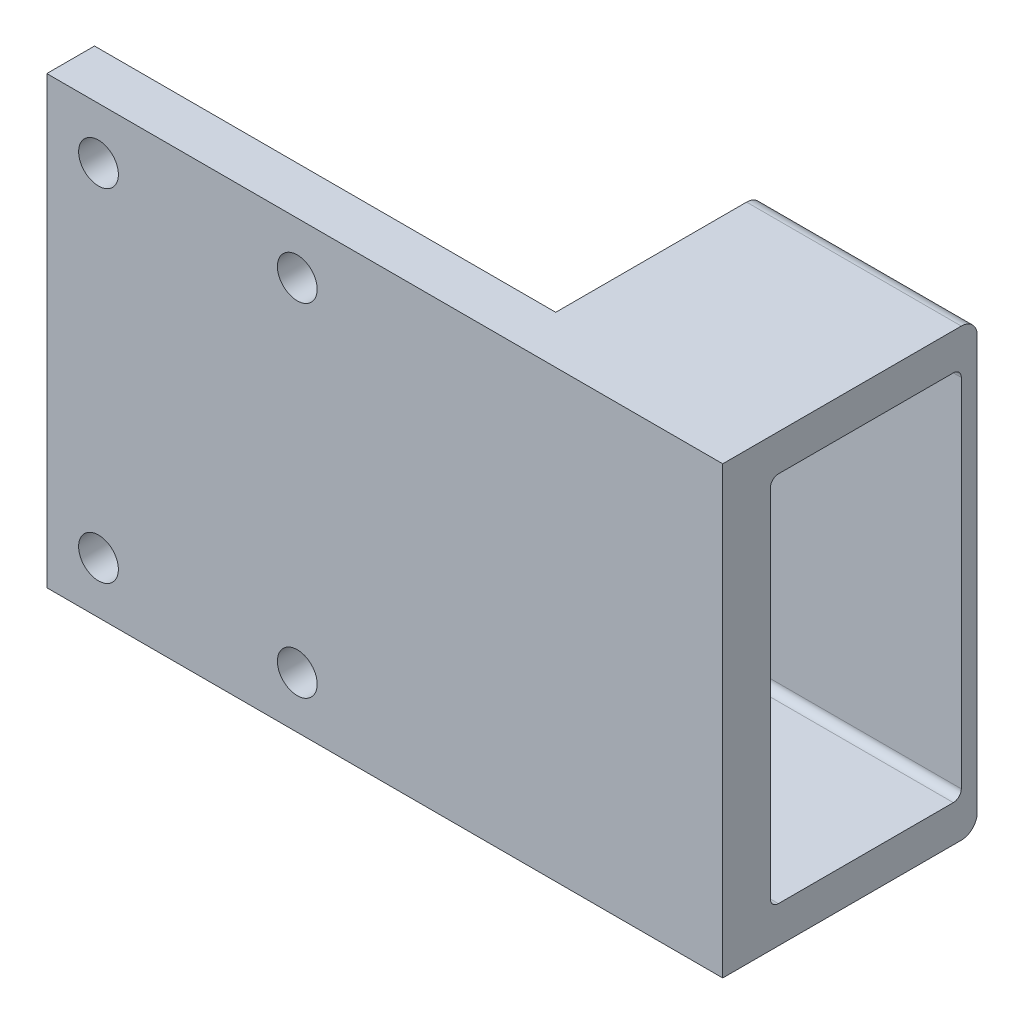
ISO-10303-21;
HEADER;
FILE_DESCRIPTION(('STEP AP214'),'2;1');
FILE_NAME('part.step','',(''),(''),'','','');
FILE_SCHEMA(('AUTOMOTIVE_DESIGN { 1 0 10303 214 1 1 1 1 }'));
ENDSEC;
DATA;
#1=APPLICATION_CONTEXT('core data for automotive mechanical design processes');
#2=APPLICATION_PROTOCOL_DEFINITION('international standard','automotive_design',2000,#1);
#3=PRODUCT_CONTEXT('',#1,'mechanical');
#4=PRODUCT('Part','Part','',(#3));
#5=PRODUCT_RELATED_PRODUCT_CATEGORY('part','',(#4));
#6=PRODUCT_DEFINITION_FORMATION('','',#4);
#7=PRODUCT_DEFINITION_CONTEXT('part definition',#1,'design');
#8=PRODUCT_DEFINITION('design','',#6,#7);
#9=PRODUCT_DEFINITION_SHAPE('','',#8);
#10=(LENGTH_UNIT() NAMED_UNIT(*) SI_UNIT(.MILLI.,.METRE.));
#11=(NAMED_UNIT(*) PLANE_ANGLE_UNIT() SI_UNIT($,.RADIAN.));
#12=(NAMED_UNIT(*) SI_UNIT($,.STERADIAN.) SOLID_ANGLE_UNIT());
#13=UNCERTAINTY_MEASURE_WITH_UNIT(LENGTH_MEASURE(1.E-05),#10,'distance_accuracy_value','');
#14=(GEOMETRIC_REPRESENTATION_CONTEXT(3) GLOBAL_UNCERTAINTY_ASSIGNED_CONTEXT((#13)) GLOBAL_UNIT_ASSIGNED_CONTEXT((#10,
#11,#12)) REPRESENTATION_CONTEXT('',''));
#15=CARTESIAN_POINT('',(0.,0.,0.));
#16=DIRECTION('',(0.,0.,1.));
#17=DIRECTION('',(1.,0.,0.));
#18=AXIS2_PLACEMENT_3D('',#15,#16,#17);
#19=CARTESIAN_POINT('',(0.,0.,3.));
#20=DIRECTION('',(-1.,0.,0.));
#21=DIRECTION('',(0.,-1.,0.));
#22=AXIS2_PLACEMENT_3D('',#19,#20,#21);
#23=PLANE('',#22);
#24=DIRECTION('',(0.,1.,0.));
#25=VECTOR('',#24,1.);
#26=CARTESIAN_POINT('',(0.,-2.3,0.));
#27=LINE('',#26,#25);
#28=CARTESIAN_POINT('',(0.,-25.2,0.));
#29=VERTEX_POINT('',#28);
#30=CARTESIAN_POINT('',(0.,-2.8,0.));
#31=VERTEX_POINT('',#30);
#32=EDGE_CURVE('E358',#29,#31,#27,.T.);
#33=ORIENTED_EDGE('',*,*,#32,.T.);
#34=CARTESIAN_POINT('',(0.,-2.8,-0.5));
#35=DIRECTION('',(-1.,0.,0.));
#36=DIRECTION('',(0.,-1.,0.));
#37=AXIS2_PLACEMENT_3D('',#34,#35,#36);
#38=CIRCLE('',#37,0.5);
#39=CARTESIAN_POINT('',(0.,-2.3,-0.5));
#40=VERTEX_POINT('',#39);
#41=EDGE_CURVE('E265',#31,#40,#38,.T.);
#42=ORIENTED_EDGE('',*,*,#41,.T.);
#43=DIRECTION('',(0.,0.,-1.));
#44=VECTOR('',#43,1.);
#45=CARTESIAN_POINT('',(0.,-2.3,-12.));
#46=LINE('',#45,#44);
#47=CARTESIAN_POINT('',(0.,-2.3,-11.5));
#48=VERTEX_POINT('',#47);
#49=EDGE_CURVE('E178',#40,#48,#46,.T.);
#50=ORIENTED_EDGE('',*,*,#49,.T.);
#51=CARTESIAN_POINT('',(0.,-2.8,-11.5));
#52=DIRECTION('',(-1.,0.,0.));
#53=DIRECTION('',(0.,-1.,0.));
#54=AXIS2_PLACEMENT_3D('',#51,#52,#53);
#55=CIRCLE('',#54,0.5);
#56=CARTESIAN_POINT('',(0.,-2.8,-12.));
#57=VERTEX_POINT('',#56);
#58=EDGE_CURVE('E248',#48,#57,#55,.T.);
#59=ORIENTED_EDGE('',*,*,#58,.T.);
#60=DIRECTION('',(0.,-1.,0.));
#61=VECTOR('',#60,1.);
#62=CARTESIAN_POINT('',(0.,-2.3,-12.));
#63=LINE('',#62,#61);
#64=CARTESIAN_POINT('',(0.,-25.2,-12.));
#65=VERTEX_POINT('',#64);
#66=EDGE_CURVE('E369',#57,#65,#63,.T.);
#67=ORIENTED_EDGE('',*,*,#66,.T.);
#68=CARTESIAN_POINT('',(0.,-25.2,-11.5));
#69=DIRECTION('',(-1.,0.,0.));
#70=DIRECTION('',(0.,-1.,0.));
#71=AXIS2_PLACEMENT_3D('',#68,#69,#70);
#72=CIRCLE('',#71,0.5);
#73=CARTESIAN_POINT('',(0.,-25.7,-11.5));
#74=VERTEX_POINT('',#73);
#75=EDGE_CURVE('E254',#65,#74,#72,.T.);
#76=ORIENTED_EDGE('',*,*,#75,.T.);
#77=DIRECTION('',(0.,0.,1.));
#78=VECTOR('',#77,1.);
#79=CARTESIAN_POINT('',(0.,-25.7,-12.));
#80=LINE('',#79,#78);
#81=CARTESIAN_POINT('',(0.,-25.7,-0.500000000000004));
#82=VERTEX_POINT('',#81);
#83=EDGE_CURVE('E362',#74,#82,#80,.T.);
#84=ORIENTED_EDGE('',*,*,#83,.T.);
#85=CARTESIAN_POINT('',(0.,-25.2,-0.5));
#86=DIRECTION('',(-1.,0.,0.));
#87=DIRECTION('',(0.,-1.,0.));
#88=AXIS2_PLACEMENT_3D('',#85,#86,#87);
#89=CIRCLE('',#88,0.5);
#90=EDGE_CURVE('E260',#82,#29,#89,.T.);
#91=ORIENTED_EDGE('',*,*,#90,.T.);
#92=EDGE_LOOP('',(#33,#42,#50,#59,#67,#76,#84,#91));
#93=FACE_BOUND('',#92,.T.);
#94=DIRECTION('',(0.,0.,-1.));
#95=VECTOR('',#94,1.);
#96=CARTESIAN_POINT('',(0.,-28.,3.));
#97=LINE('',#96,#95);
#98=CARTESIAN_POINT('',(0.,-28.,3.));
#99=VERTEX_POINT('',#98);
#100=CARTESIAN_POINT('',(0.,-28.,-12.));
#101=VERTEX_POINT('',#100);
#102=EDGE_CURVE('E204',#99,#101,#97,.T.);
#103=ORIENTED_EDGE('',*,*,#102,.T.);
#104=CARTESIAN_POINT('',(0.,-27.,-12.));
#105=DIRECTION('',(-1.,0.,0.));
#106=DIRECTION('',(0.,-1.,0.));
#107=AXIS2_PLACEMENT_3D('',#104,#105,#106);
#108=CIRCLE('',#107,1.);
#109=CARTESIAN_POINT('',(0.,-27.,-13.));
#110=VERTEX_POINT('',#109);
#111=EDGE_CURVE('E48',#101,#110,#108,.F.);
#112=ORIENTED_EDGE('',*,*,#111,.T.);
#113=DIRECTION('',(0.,-1.,0.));
#114=VECTOR('',#113,1.);
#115=CARTESIAN_POINT('',(0.,0.,-13.));
#116=LINE('',#115,#114);
#117=CARTESIAN_POINT('',(0.,-1.,-13.));
#118=VERTEX_POINT('',#117);
#119=EDGE_CURVE('E288',#118,#110,#116,.T.);
#120=ORIENTED_EDGE('',*,*,#119,.F.);
#121=CARTESIAN_POINT('',(0.,-1.,-12.));
#122=DIRECTION('',(-1.,0.,0.));
#123=DIRECTION('',(0.,-1.,0.));
#124=AXIS2_PLACEMENT_3D('',#121,#122,#123);
#125=CIRCLE('',#124,1.);
#126=CARTESIAN_POINT('',(0.,0.,-12.));
#127=VERTEX_POINT('',#126);
#128=EDGE_CURVE('E55',#118,#127,#125,.F.);
#129=ORIENTED_EDGE('',*,*,#128,.T.);
#130=DIRECTION('',(0.,0.,-1.));
#131=VECTOR('',#130,1.);
#132=CARTESIAN_POINT('',(0.,0.,3.));
#133=LINE('',#132,#131);
#134=CARTESIAN_POINT('',(0.,0.,3.));
#135=VERTEX_POINT('',#134);
#136=EDGE_CURVE('E214',#135,#127,#133,.T.);
#137=ORIENTED_EDGE('',*,*,#136,.F.);
#138=DIRECTION('',(0.,1.,0.));
#139=VECTOR('',#138,1.);
#140=CARTESIAN_POINT('',(0.,0.,3.));
#141=LINE('',#140,#139);
#142=EDGE_CURVE('E203',#99,#135,#141,.T.);
#143=ORIENTED_EDGE('',*,*,#142,.F.);
#144=EDGE_LOOP('',(#103,#112,#120,#129,#137,#143));
#145=FACE_BOUND('',#144,.T.);
#146=ADVANCED_FACE('F39',(#93,#145),#23,.F.);
#147=CARTESIAN_POINT('',(0.,0.,3.));
#148=DIRECTION('',(0.,-1.,0.));
#149=DIRECTION('',(1.,0.,0.));
#150=AXIS2_PLACEMENT_3D('',#147,#148,#149);
#151=PLANE('',#150);
#152=ORIENTED_EDGE('',*,*,#136,.T.);
#153=DIRECTION('',(1.,0.,0.));
#154=VECTOR('',#153,1.);
#155=CARTESIAN_POINT('',(-13.5,0.,-12.));
#156=LINE('',#155,#154);
#157=CARTESIAN_POINT('',(-13.5,0.,-12.));
#158=VERTEX_POINT('',#157);
#159=EDGE_CURVE('E11',#127,#158,#156,.F.);
#160=ORIENTED_EDGE('',*,*,#159,.T.);
#161=DIRECTION('',(0.,0.,1.));
#162=VECTOR('',#161,1.);
#163=CARTESIAN_POINT('',(-13.5,0.,-13.));
#164=LINE('',#163,#162);
#165=CARTESIAN_POINT('',(-13.5,0.,0.));
#166=VERTEX_POINT('',#165);
#167=EDGE_CURVE('E154',#158,#166,#164,.T.);
#168=ORIENTED_EDGE('',*,*,#167,.T.);
#169=DIRECTION('',(-1.,0.,0.));
#170=VECTOR('',#169,1.);
#171=CARTESIAN_POINT('',(0.,0.,0.));
#172=LINE('',#171,#170);
#173=CARTESIAN_POINT('',(-42.5,0.,0.));
#174=VERTEX_POINT('',#173);
#175=EDGE_CURVE('E159',#166,#174,#172,.T.);
#176=ORIENTED_EDGE('',*,*,#175,.T.);
#177=DIRECTION('',(0.,0.,-1.));
#178=VECTOR('',#177,1.);
#179=CARTESIAN_POINT('',(-42.5,0.,3.));
#180=LINE('',#179,#178);
#181=CARTESIAN_POINT('',(-42.5,0.,3.));
#182=VERTEX_POINT('',#181);
#183=EDGE_CURVE('E211',#182,#174,#180,.T.);
#184=ORIENTED_EDGE('',*,*,#183,.F.);
#185=DIRECTION('',(-1.,0.,0.));
#186=VECTOR('',#185,1.);
#187=CARTESIAN_POINT('',(0.,0.,3.));
#188=LINE('',#187,#186);
#189=EDGE_CURVE('E334',#135,#182,#188,.T.);
#190=ORIENTED_EDGE('',*,*,#189,.F.);
#191=EDGE_LOOP('',(#152,#160,#168,#176,#184,#190));
#192=FACE_BOUND('',#191,.T.);
#193=ADVANCED_FACE('F156',(#192),#151,.F.);
#194=CARTESIAN_POINT('',(-42.5,0.,3.));
#195=DIRECTION('',(1.,0.,0.));
#196=DIRECTION('',(0.,1.,0.));
#197=AXIS2_PLACEMENT_3D('',#194,#195,#196);
#198=PLANE('',#197);
#199=DIRECTION('',(0.,-1.,0.));
#200=VECTOR('',#199,1.);
#201=CARTESIAN_POINT('',(-42.5,0.,0.));
#202=LINE('',#201,#200);
#203=CARTESIAN_POINT('',(-42.5,-28.,0.));
#204=VERTEX_POINT('',#203);
#205=EDGE_CURVE('E185',#174,#204,#202,.T.);
#206=ORIENTED_EDGE('',*,*,#205,.T.);
#207=DIRECTION('',(0.,0.,-1.));
#208=VECTOR('',#207,1.);
#209=CARTESIAN_POINT('',(-42.5,-28.,3.));
#210=LINE('',#209,#208);
#211=CARTESIAN_POINT('',(-42.5,-28.,3.));
#212=VERTEX_POINT('',#211);
#213=EDGE_CURVE('E207',#212,#204,#210,.T.);
#214=ORIENTED_EDGE('',*,*,#213,.F.);
#215=DIRECTION('',(0.,-1.,0.));
#216=VECTOR('',#215,1.);
#217=CARTESIAN_POINT('',(-42.5,0.,3.));
#218=LINE('',#217,#216);
#219=EDGE_CURVE('E336',#182,#212,#218,.T.);
#220=ORIENTED_EDGE('',*,*,#219,.F.);
#221=ORIENTED_EDGE('',*,*,#183,.T.);
#222=EDGE_LOOP('',(#206,#214,#220,#221));
#223=FACE_BOUND('',#222,.T.);
#224=ADVANCED_FACE('F419',(#223),#198,.F.);
#225=CARTESIAN_POINT('',(0.,-28.,3.));
#226=DIRECTION('',(0.,1.,0.));
#227=DIRECTION('',(-1.,0.,0.));
#228=AXIS2_PLACEMENT_3D('',#225,#226,#227);
#229=PLANE('',#228);
#230=DIRECTION('',(0.,0.,1.));
#231=VECTOR('',#230,1.);
#232=CARTESIAN_POINT('',(-13.5,-28.,-13.));
#233=LINE('',#232,#231);
#234=CARTESIAN_POINT('',(-13.5,-28.,-12.));
#235=VERTEX_POINT('',#234);
#236=CARTESIAN_POINT('',(-13.5,-28.,0.));
#237=VERTEX_POINT('',#236);
#238=EDGE_CURVE('E165',#235,#237,#233,.T.);
#239=ORIENTED_EDGE('',*,*,#238,.F.);
#240=DIRECTION('',(-1.,0.,0.));
#241=VECTOR('',#240,1.);
#242=CARTESIAN_POINT('',(0.,-28.,-12.));
#243=LINE('',#242,#241);
#244=EDGE_CURVE('E63',#235,#101,#243,.F.);
#245=ORIENTED_EDGE('',*,*,#244,.T.);
#246=ORIENTED_EDGE('',*,*,#102,.F.);
#247=DIRECTION('',(1.,0.,0.));
#248=VECTOR('',#247,1.);
#249=CARTESIAN_POINT('',(0.,-28.,3.));
#250=LINE('',#249,#248);
#251=EDGE_CURVE('E197',#212,#99,#250,.T.);
#252=ORIENTED_EDGE('',*,*,#251,.F.);
#253=ORIENTED_EDGE('',*,*,#213,.T.);
#254=DIRECTION('',(1.,0.,0.));
#255=VECTOR('',#254,1.);
#256=CARTESIAN_POINT('',(0.,-28.,0.));
#257=LINE('',#256,#255);
#258=EDGE_CURVE('E191',#204,#237,#257,.T.);
#259=ORIENTED_EDGE('',*,*,#258,.T.);
#260=EDGE_LOOP('',(#239,#245,#246,#252,#253,#259));
#261=FACE_BOUND('',#260,.T.);
#262=ADVANCED_FACE('F300',(#261),#229,.F.);
#263=CARTESIAN_POINT('',(0.,0.,3.));
#264=DIRECTION('',(0.,0.,-1.));
#265=DIRECTION('',(-1.,0.,0.));
#266=AXIS2_PLACEMENT_3D('',#263,#264,#265);
#267=PLANE('',#266);
#268=CARTESIAN_POINT('',(-26.75,-24.75,3.));
#269=DIRECTION('',(0.,0.,-1.));
#270=DIRECTION('',(-1.,0.,0.));
#271=AXIS2_PLACEMENT_3D('',#268,#269,#270);
#272=CIRCLE('',#271,1.25);
#273=CARTESIAN_POINT('',(-28.,-24.75,3.));
#274=VERTEX_POINT('',#273);
#275=EDGE_CURVE('E313',#274,#274,#272,.T.);
#276=ORIENTED_EDGE('',*,*,#275,.T.);
#277=EDGE_LOOP('',(#276));
#278=FACE_BOUND('',#277,.T.);
#279=CARTESIAN_POINT('',(-39.25,-3.25,3.));
#280=DIRECTION('',(0.,0.,-1.));
#281=DIRECTION('',(1.,0.,0.));
#282=AXIS2_PLACEMENT_3D('',#279,#280,#281);
#283=CIRCLE('',#282,1.25);
#284=CARTESIAN_POINT('',(-38.,-3.25,3.));
#285=VERTEX_POINT('',#284);
#286=EDGE_CURVE('E321',#285,#285,#283,.T.);
#287=ORIENTED_EDGE('',*,*,#286,.T.);
#288=EDGE_LOOP('',(#287));
#289=FACE_BOUND('',#288,.T.);
#290=CARTESIAN_POINT('',(-26.75,-3.25,3.));
#291=DIRECTION('',(0.,0.,-1.));
#292=DIRECTION('',(1.,0.,0.));
#293=AXIS2_PLACEMENT_3D('',#290,#291,#292);
#294=CIRCLE('',#293,1.25);
#295=CARTESIAN_POINT('',(-25.5,-3.25,3.));
#296=VERTEX_POINT('',#295);
#297=EDGE_CURVE('E306',#296,#296,#294,.T.);
#298=ORIENTED_EDGE('',*,*,#297,.T.);
#299=EDGE_LOOP('',(#298));
#300=FACE_BOUND('',#299,.T.);
#301=CARTESIAN_POINT('',(-39.25,-24.75,3.));
#302=DIRECTION('',(0.,0.,-1.));
#303=DIRECTION('',(-1.,0.,0.));
#304=AXIS2_PLACEMENT_3D('',#301,#302,#303);
#305=CIRCLE('',#304,1.25);
#306=CARTESIAN_POINT('',(-40.5,-24.75,3.));
#307=VERTEX_POINT('',#306);
#308=EDGE_CURVE('E187',#307,#307,#305,.T.);
#309=ORIENTED_EDGE('',*,*,#308,.T.);
#310=EDGE_LOOP('',(#309));
#311=FACE_BOUND('',#310,.T.);
#312=ORIENTED_EDGE('',*,*,#142,.T.);
#313=ORIENTED_EDGE('',*,*,#189,.T.);
#314=ORIENTED_EDGE('',*,*,#219,.T.);
#315=ORIENTED_EDGE('',*,*,#251,.T.);
#316=EDGE_LOOP('',(#312,#313,#314,#315));
#317=FACE_BOUND('',#316,.T.);
#318=ADVANCED_FACE('F343',(#278,#289,#300,#311,#317),#267,.F.);
#319=CARTESIAN_POINT('',(0.,0.,0.));
#320=DIRECTION('',(0.,0.,-1.));
#321=DIRECTION('',(-1.,0.,0.));
#322=AXIS2_PLACEMENT_3D('',#319,#320,#321);
#323=PLANE('',#322);
#324=ORIENTED_EDGE('',*,*,#32,.F.);
#325=DIRECTION('',(-1.,0.,0.));
#326=VECTOR('',#325,1.);
#327=CARTESIAN_POINT('',(0.,-25.2,0.));
#328=LINE('',#327,#326);
#329=CARTESIAN_POINT('',(-13.5,-25.2,0.));
#330=VERTEX_POINT('',#329);
#331=EDGE_CURVE('E241',#29,#330,#328,.T.);
#332=ORIENTED_EDGE('',*,*,#331,.T.);
#333=DIRECTION('',(0.,1.,0.));
#334=VECTOR('',#333,1.);
#335=CARTESIAN_POINT('',(-13.5,0.,0.));
#336=LINE('',#335,#334);
#337=EDGE_CURVE('E177',#237,#330,#336,.T.);
#338=ORIENTED_EDGE('',*,*,#337,.F.);
#339=ORIENTED_EDGE('',*,*,#258,.F.);
#340=ORIENTED_EDGE('',*,*,#205,.F.);
#341=ORIENTED_EDGE('',*,*,#175,.F.);
#342=CARTESIAN_POINT('',(-13.5,-2.8,0.));
#343=VERTEX_POINT('',#342);
#344=EDGE_CURVE('E169',#343,#166,#336,.T.);
#345=ORIENTED_EDGE('',*,*,#344,.F.);
#346=DIRECTION('',(-1.,0.,0.));
#347=VECTOR('',#346,1.);
#348=CARTESIAN_POINT('',(0.,-2.8,0.));
#349=LINE('',#348,#347);
#350=EDGE_CURVE('E238',#343,#31,#349,.F.);
#351=ORIENTED_EDGE('',*,*,#350,.T.);
#352=EDGE_LOOP('',(#324,#332,#338,#339,#340,#341,#345,#351));
#353=FACE_BOUND('',#352,.T.);
#354=CARTESIAN_POINT('',(-26.75,-24.75,0.));
#355=DIRECTION('',(0.,0.,-1.));
#356=DIRECTION('',(-1.,0.,0.));
#357=AXIS2_PLACEMENT_3D('',#354,#355,#356);
#358=CIRCLE('',#357,1.25);
#359=CARTESIAN_POINT('',(-28.,-24.75,0.));
#360=VERTEX_POINT('',#359);
#361=EDGE_CURVE('E317',#360,#360,#358,.T.);
#362=ORIENTED_EDGE('',*,*,#361,.F.);
#363=EDGE_LOOP('',(#362));
#364=FACE_BOUND('',#363,.T.);
#365=CARTESIAN_POINT('',(-39.25,-3.25,0.));
#366=DIRECTION('',(0.,0.,-1.));
#367=DIRECTION('',(1.,0.,0.));
#368=AXIS2_PLACEMENT_3D('',#365,#366,#367);
#369=CIRCLE('',#368,1.25);
#370=CARTESIAN_POINT('',(-38.,-3.25,0.));
#371=VERTEX_POINT('',#370);
#372=EDGE_CURVE('E311',#371,#371,#369,.T.);
#373=ORIENTED_EDGE('',*,*,#372,.F.);
#374=EDGE_LOOP('',(#373));
#375=FACE_BOUND('',#374,.T.);
#376=CARTESIAN_POINT('',(-26.75,-3.25,0.));
#377=DIRECTION('',(0.,0.,-1.));
#378=DIRECTION('',(1.,0.,0.));
#379=AXIS2_PLACEMENT_3D('',#376,#377,#378);
#380=CIRCLE('',#379,1.25);
#381=CARTESIAN_POINT('',(-25.5,-3.25,0.));
#382=VERTEX_POINT('',#381);
#383=EDGE_CURVE('E302',#382,#382,#380,.T.);
#384=ORIENTED_EDGE('',*,*,#383,.F.);
#385=EDGE_LOOP('',(#384));
#386=FACE_BOUND('',#385,.T.);
#387=CARTESIAN_POINT('',(-39.25,-24.75,0.));
#388=DIRECTION('',(0.,0.,-1.));
#389=DIRECTION('',(-1.,0.,0.));
#390=AXIS2_PLACEMENT_3D('',#387,#388,#389);
#391=CIRCLE('',#390,1.25);
#392=CARTESIAN_POINT('',(-40.5,-24.75,0.));
#393=VERTEX_POINT('',#392);
#394=EDGE_CURVE('E194',#393,#393,#391,.T.);
#395=ORIENTED_EDGE('',*,*,#394,.F.);
#396=EDGE_LOOP('',(#395));
#397=FACE_BOUND('',#396,.T.);
#398=ADVANCED_FACE('F182',(#353,#364,#375,#386,#397),#323,.T.);
#399=CARTESIAN_POINT('',(-39.25,-24.75,3.));
#400=DIRECTION('',(0.,0.,-1.));
#401=DIRECTION('',(-1.,0.,0.));
#402=AXIS2_PLACEMENT_3D('',#399,#400,#401);
#403=CYLINDRICAL_SURFACE('',#402,1.25);
#404=ORIENTED_EDGE('',*,*,#308,.F.);
#405=EDGE_LOOP('',(#404));
#406=FACE_BOUND('',#405,.T.);
#407=ORIENTED_EDGE('',*,*,#394,.T.);
#408=EDGE_LOOP('',(#407));
#409=FACE_BOUND('',#408,.T.);
#410=ADVANCED_FACE('F533',(#406,#409),#403,.F.);
#411=CARTESIAN_POINT('',(-26.75,-3.25,3.));
#412=DIRECTION('',(0.,0.,-1.));
#413=DIRECTION('',(-1.,0.,0.));
#414=AXIS2_PLACEMENT_3D('',#411,#412,#413);
#415=CYLINDRICAL_SURFACE('',#414,1.25);
#416=ORIENTED_EDGE('',*,*,#297,.F.);
#417=EDGE_LOOP('',(#416));
#418=FACE_BOUND('',#417,.T.);
#419=ORIENTED_EDGE('',*,*,#383,.T.);
#420=EDGE_LOOP('',(#419));
#421=FACE_BOUND('',#420,.T.);
#422=ADVANCED_FACE('F555',(#418,#421),#415,.F.);
#423=CARTESIAN_POINT('',(-39.25,-3.25,3.));
#424=DIRECTION('',(0.,0.,-1.));
#425=DIRECTION('',(-1.,0.,0.));
#426=AXIS2_PLACEMENT_3D('',#423,#424,#425);
#427=CYLINDRICAL_SURFACE('',#426,1.25);
#428=ORIENTED_EDGE('',*,*,#286,.F.);
#429=EDGE_LOOP('',(#428));
#430=FACE_BOUND('',#429,.T.);
#431=ORIENTED_EDGE('',*,*,#372,.T.);
#432=EDGE_LOOP('',(#431));
#433=FACE_BOUND('',#432,.T.);
#434=ADVANCED_FACE('F545',(#430,#433),#427,.F.);
#435=CARTESIAN_POINT('',(-26.75,-24.75,3.));
#436=DIRECTION('',(0.,0.,-1.));
#437=DIRECTION('',(-1.,0.,0.));
#438=AXIS2_PLACEMENT_3D('',#435,#436,#437);
#439=CYLINDRICAL_SURFACE('',#438,1.25);
#440=ORIENTED_EDGE('',*,*,#275,.F.);
#441=EDGE_LOOP('',(#440));
#442=FACE_BOUND('',#441,.T.);
#443=ORIENTED_EDGE('',*,*,#361,.T.);
#444=EDGE_LOOP('',(#443));
#445=FACE_BOUND('',#444,.T.);
#446=ADVANCED_FACE('F473',(#442,#445),#439,.F.);
#447=CARTESIAN_POINT('',(-13.5,0.,-13.));
#448=DIRECTION('',(1.,0.,0.));
#449=DIRECTION('',(0.,1.,0.));
#450=AXIS2_PLACEMENT_3D('',#447,#448,#449);
#451=PLANE('',#450);
#452=DIRECTION('',(0.,1.,0.));
#453=VECTOR('',#452,1.);
#454=CARTESIAN_POINT('',(-13.5,0.,-13.));
#455=LINE('',#454,#453);
#456=CARTESIAN_POINT('',(-13.5,-27.,-13.));
#457=VERTEX_POINT('',#456);
#458=CARTESIAN_POINT('',(-13.5,-1.,-13.));
#459=VERTEX_POINT('',#458);
#460=EDGE_CURVE('E166',#457,#459,#455,.T.);
#461=ORIENTED_EDGE('',*,*,#460,.F.);
#462=CARTESIAN_POINT('',(-13.5,-27.,-12.));
#463=DIRECTION('',(1.,0.,0.));
#464=DIRECTION('',(0.,1.,0.));
#465=AXIS2_PLACEMENT_3D('',#462,#463,#464);
#466=CIRCLE('',#465,1.);
#467=EDGE_CURVE('E279',#457,#235,#466,.F.);
#468=ORIENTED_EDGE('',*,*,#467,.T.);
#469=ORIENTED_EDGE('',*,*,#238,.T.);
#470=ORIENTED_EDGE('',*,*,#337,.T.);
#471=CARTESIAN_POINT('',(-13.5,-25.2,-0.5));
#472=DIRECTION('',(1.,0.,0.));
#473=DIRECTION('',(0.,1.,0.));
#474=AXIS2_PLACEMENT_3D('',#471,#472,#473);
#475=CIRCLE('',#474,0.5);
#476=CARTESIAN_POINT('',(-13.5,-25.7,-0.500000000000004));
#477=VERTEX_POINT('',#476);
#478=EDGE_CURVE('E257',#330,#477,#475,.T.);
#479=ORIENTED_EDGE('',*,*,#478,.T.);
#480=DIRECTION('',(0.,0.,1.));
#481=VECTOR('',#480,1.);
#482=CARTESIAN_POINT('',(-13.5,-25.7,-12.));
#483=LINE('',#482,#481);
#484=CARTESIAN_POINT('',(-13.5,-25.7,-11.5));
#485=VERTEX_POINT('',#484);
#486=EDGE_CURVE('E377',#485,#477,#483,.T.);
#487=ORIENTED_EDGE('',*,*,#486,.F.);
#488=CARTESIAN_POINT('',(-13.5,-25.2,-11.5));
#489=DIRECTION('',(1.,0.,0.));
#490=DIRECTION('',(0.,1.,0.));
#491=AXIS2_PLACEMENT_3D('',#488,#489,#490);
#492=CIRCLE('',#491,0.5);
#493=CARTESIAN_POINT('',(-13.5,-25.2,-12.));
#494=VERTEX_POINT('',#493);
#495=EDGE_CURVE('E251',#485,#494,#492,.T.);
#496=ORIENTED_EDGE('',*,*,#495,.T.);
#497=DIRECTION('',(0.,-1.,0.));
#498=VECTOR('',#497,1.);
#499=CARTESIAN_POINT('',(-13.5,-2.3,-12.));
#500=LINE('',#499,#498);
#501=CARTESIAN_POINT('',(-13.5,-2.8,-12.));
#502=VERTEX_POINT('',#501);
#503=EDGE_CURVE('E373',#502,#494,#500,.T.);
#504=ORIENTED_EDGE('',*,*,#503,.F.);
#505=CARTESIAN_POINT('',(-13.5,-2.8,-11.5));
#506=DIRECTION('',(1.,0.,0.));
#507=DIRECTION('',(0.,1.,0.));
#508=AXIS2_PLACEMENT_3D('',#505,#506,#507);
#509=CIRCLE('',#508,0.5);
#510=CARTESIAN_POINT('',(-13.5,-2.3,-11.5));
#511=VERTEX_POINT('',#510);
#512=EDGE_CURVE('E245',#502,#511,#509,.T.);
#513=ORIENTED_EDGE('',*,*,#512,.T.);
#514=DIRECTION('',(0.,0.,-1.));
#515=VECTOR('',#514,1.);
#516=CARTESIAN_POINT('',(-13.5,-2.3,-12.));
#517=LINE('',#516,#515);
#518=CARTESIAN_POINT('',(-13.5,-2.3,-0.5));
#519=VERTEX_POINT('',#518);
#520=EDGE_CURVE('E379',#519,#511,#517,.T.);
#521=ORIENTED_EDGE('',*,*,#520,.F.);
#522=CARTESIAN_POINT('',(-13.5,-2.8,-0.5));
#523=DIRECTION('',(1.,0.,0.));
#524=DIRECTION('',(0.,1.,0.));
#525=AXIS2_PLACEMENT_3D('',#522,#523,#524);
#526=CIRCLE('',#525,0.5);
#527=EDGE_CURVE('E173',#519,#343,#526,.T.);
#528=ORIENTED_EDGE('',*,*,#527,.T.);
#529=ORIENTED_EDGE('',*,*,#344,.T.);
#530=ORIENTED_EDGE('',*,*,#167,.F.);
#531=CARTESIAN_POINT('',(-13.5,-1.,-12.));
#532=DIRECTION('',(1.,0.,0.));
#533=DIRECTION('',(0.,1.,0.));
#534=AXIS2_PLACEMENT_3D('',#531,#532,#533);
#535=CIRCLE('',#534,1.);
#536=EDGE_CURVE('E276',#158,#459,#535,.F.);
#537=ORIENTED_EDGE('',*,*,#536,.T.);
#538=EDGE_LOOP('',(#461,#468,#469,#470,#479,#487,#496,#504,#513,#521,#528,#529,#530,#537));
#539=FACE_BOUND('',#538,.T.);
#540=ADVANCED_FACE('F171',(#539),#451,.F.);
#541=CARTESIAN_POINT('',(0.,0.,-13.));
#542=DIRECTION('',(0.,0.,-1.));
#543=DIRECTION('',(-1.,0.,0.));
#544=AXIS2_PLACEMENT_3D('',#541,#542,#543);
#545=PLANE('',#544);
#546=ORIENTED_EDGE('',*,*,#119,.T.);
#547=DIRECTION('',(-1.,0.,0.));
#548=VECTOR('',#547,1.);
#549=CARTESIAN_POINT('',(-13.5,-27.,-13.));
#550=LINE('',#549,#548);
#551=EDGE_CURVE('E272',#110,#457,#550,.T.);
#552=ORIENTED_EDGE('',*,*,#551,.T.);
#553=ORIENTED_EDGE('',*,*,#460,.T.);
#554=DIRECTION('',(1.,0.,0.));
#555=VECTOR('',#554,1.);
#556=CARTESIAN_POINT('',(0.,-1.,-13.));
#557=LINE('',#556,#555);
#558=EDGE_CURVE('E268',#459,#118,#557,.T.);
#559=ORIENTED_EDGE('',*,*,#558,.T.);
#560=EDGE_LOOP('',(#546,#552,#553,#559));
#561=FACE_BOUND('',#560,.T.);
#562=ADVANCED_FACE('F293',(#561),#545,.T.);
#563=CARTESIAN_POINT('',(0.,-2.3,-12.));
#564=DIRECTION('',(0.,0.,-1.));
#565=DIRECTION('',(0.,1.,0.));
#566=AXIS2_PLACEMENT_3D('',#563,#564,#565);
#567=PLANE('',#566);
#568=ORIENTED_EDGE('',*,*,#66,.F.);
#569=DIRECTION('',(-1.,0.,0.));
#570=VECTOR('',#569,1.);
#571=CARTESIAN_POINT('',(-13.5,-2.8,-12.));
#572=LINE('',#571,#570);
#573=EDGE_CURVE('E220',#57,#502,#572,.T.);
#574=ORIENTED_EDGE('',*,*,#573,.T.);
#575=ORIENTED_EDGE('',*,*,#503,.T.);
#576=DIRECTION('',(-1.,0.,0.));
#577=VECTOR('',#576,1.);
#578=CARTESIAN_POINT('',(0.,-25.2,-12.));
#579=LINE('',#578,#577);
#580=EDGE_CURVE('E217',#494,#65,#579,.F.);
#581=ORIENTED_EDGE('',*,*,#580,.T.);
#582=EDGE_LOOP('',(#568,#574,#575,#581));
#583=FACE_BOUND('',#582,.T.);
#584=ADVANCED_FACE('F399',(#583),#567,.F.);
#585=CARTESIAN_POINT('',(0.,-2.3,-12.));
#586=DIRECTION('',(0.,1.,0.));
#587=DIRECTION('',(-1.,0.,0.));
#588=AXIS2_PLACEMENT_3D('',#585,#586,#587);
#589=PLANE('',#588);
#590=ORIENTED_EDGE('',*,*,#520,.T.);
#591=DIRECTION('',(-1.,0.,0.));
#592=VECTOR('',#591,1.);
#593=CARTESIAN_POINT('',(0.,-2.3,-11.5));
#594=LINE('',#593,#592);
#595=EDGE_CURVE('E228',#511,#48,#594,.F.);
#596=ORIENTED_EDGE('',*,*,#595,.T.);
#597=ORIENTED_EDGE('',*,*,#49,.F.);
#598=DIRECTION('',(-1.,0.,0.));
#599=VECTOR('',#598,1.);
#600=CARTESIAN_POINT('',(0.,-2.3,-0.5));
#601=LINE('',#600,#599);
#602=EDGE_CURVE('E224',#40,#519,#601,.T.);
#603=ORIENTED_EDGE('',*,*,#602,.T.);
#604=EDGE_LOOP('',(#590,#596,#597,#603));
#605=FACE_BOUND('',#604,.T.);
#606=ADVANCED_FACE('F403',(#605),#589,.F.);
#607=CARTESIAN_POINT('',(0.,-25.7,-12.));
#608=DIRECTION('',(0.,-1.,0.));
#609=DIRECTION('',(1.,0.,0.));
#610=AXIS2_PLACEMENT_3D('',#607,#608,#609);
#611=PLANE('',#610);
#612=ORIENTED_EDGE('',*,*,#83,.F.);
#613=DIRECTION('',(-1.,0.,0.));
#614=VECTOR('',#613,1.);
#615=CARTESIAN_POINT('',(-13.5,-25.7,-11.5));
#616=LINE('',#615,#614);
#617=EDGE_CURVE('E234',#74,#485,#616,.T.);
#618=ORIENTED_EDGE('',*,*,#617,.T.);
#619=ORIENTED_EDGE('',*,*,#486,.T.);
#620=DIRECTION('',(-1.,0.,0.));
#621=VECTOR('',#620,1.);
#622=CARTESIAN_POINT('',(0.,-25.7,-0.5));
#623=LINE('',#622,#621);
#624=EDGE_CURVE('E231',#477,#82,#623,.F.);
#625=ORIENTED_EDGE('',*,*,#624,.T.);
#626=EDGE_LOOP('',(#612,#618,#619,#625));
#627=FACE_BOUND('',#626,.T.);
#628=ADVANCED_FACE('F397',(#627),#611,.F.);
#629=CARTESIAN_POINT('',(0.,-2.8,-11.5));
#630=DIRECTION('',(1.,0.,0.));
#631=DIRECTION('',(0.,1.,0.));
#632=AXIS2_PLACEMENT_3D('',#629,#630,#631);
#633=CYLINDRICAL_SURFACE('',#632,0.5);
#634=ORIENTED_EDGE('',*,*,#58,.F.);
#635=ORIENTED_EDGE('',*,*,#595,.F.);
#636=ORIENTED_EDGE('',*,*,#512,.F.);
#637=ORIENTED_EDGE('',*,*,#573,.F.);
#638=EDGE_LOOP('',(#634,#635,#636,#637));
#639=FACE_BOUND('',#638,.T.);
#640=ADVANCED_FACE('F401',(#639),#633,.F.);
#641=CARTESIAN_POINT('',(0.,-25.2,-11.5));
#642=DIRECTION('',(1.,0.,0.));
#643=DIRECTION('',(0.,1.,0.));
#644=AXIS2_PLACEMENT_3D('',#641,#642,#643);
#645=CYLINDRICAL_SURFACE('',#644,0.5);
#646=ORIENTED_EDGE('',*,*,#75,.F.);
#647=ORIENTED_EDGE('',*,*,#580,.F.);
#648=ORIENTED_EDGE('',*,*,#495,.F.);
#649=ORIENTED_EDGE('',*,*,#617,.F.);
#650=EDGE_LOOP('',(#646,#647,#648,#649));
#651=FACE_BOUND('',#650,.T.);
#652=ADVANCED_FACE('F395',(#651),#645,.F.);
#653=CARTESIAN_POINT('',(0.,-25.2,-0.5));
#654=DIRECTION('',(-1.,0.,0.));
#655=DIRECTION('',(0.,-1.,0.));
#656=AXIS2_PLACEMENT_3D('',#653,#654,#655);
#657=CYLINDRICAL_SURFACE('',#656,0.5);
#658=ORIENTED_EDGE('',*,*,#90,.F.);
#659=ORIENTED_EDGE('',*,*,#624,.F.);
#660=ORIENTED_EDGE('',*,*,#478,.F.);
#661=ORIENTED_EDGE('',*,*,#331,.F.);
#662=EDGE_LOOP('',(#658,#659,#660,#661));
#663=FACE_BOUND('',#662,.T.);
#664=ADVANCED_FACE('F356',(#663),#657,.F.);
#665=CARTESIAN_POINT('',(0.,-2.8,-0.5));
#666=DIRECTION('',(-1.,0.,0.));
#667=DIRECTION('',(0.,-1.,0.));
#668=AXIS2_PLACEMENT_3D('',#665,#666,#667);
#669=CYLINDRICAL_SURFACE('',#668,0.5);
#670=ORIENTED_EDGE('',*,*,#41,.F.);
#671=ORIENTED_EDGE('',*,*,#350,.F.);
#672=ORIENTED_EDGE('',*,*,#527,.F.);
#673=ORIENTED_EDGE('',*,*,#602,.F.);
#674=EDGE_LOOP('',(#670,#671,#672,#673));
#675=FACE_BOUND('',#674,.T.);
#676=ADVANCED_FACE('F406',(#675),#669,.F.);
#677=CARTESIAN_POINT('',(0.,-27.,-12.));
#678=DIRECTION('',(1.,0.,0.));
#679=DIRECTION('',(0.,1.,0.));
#680=AXIS2_PLACEMENT_3D('',#677,#678,#679);
#681=CYLINDRICAL_SURFACE('',#680,1.);
#682=ORIENTED_EDGE('',*,*,#111,.F.);
#683=ORIENTED_EDGE('',*,*,#244,.F.);
#684=ORIENTED_EDGE('',*,*,#467,.F.);
#685=ORIENTED_EDGE('',*,*,#551,.F.);
#686=EDGE_LOOP('',(#682,#683,#684,#685));
#687=FACE_BOUND('',#686,.T.);
#688=ADVANCED_FACE('F298',(#687),#681,.T.);
#689=CARTESIAN_POINT('',(0.,-1.,-12.));
#690=DIRECTION('',(-1.,0.,0.));
#691=DIRECTION('',(0.,-1.,0.));
#692=AXIS2_PLACEMENT_3D('',#689,#690,#691);
#693=CYLINDRICAL_SURFACE('',#692,1.);
#694=ORIENTED_EDGE('',*,*,#536,.F.);
#695=ORIENTED_EDGE('',*,*,#159,.F.);
#696=ORIENTED_EDGE('',*,*,#128,.F.);
#697=ORIENTED_EDGE('',*,*,#558,.F.);
#698=EDGE_LOOP('',(#694,#695,#696,#697));
#699=FACE_BOUND('',#698,.T.);
#700=ADVANCED_FACE('F41',(#699),#693,.T.);
#701=CLOSED_SHELL('',(#146,#193,#224,#262,#318,#398,#410,#422,#434,#446,#540,#562,#584,#606,
#628,#640,#652,#664,#676,#688,#700));
#702=MANIFOLD_SOLID_BREP('B2',#701);
#703=ADVANCED_BREP_SHAPE_REPRESENTATION('',(#18,#702),#14);
#704=SHAPE_DEFINITION_REPRESENTATION(#9,#703);
ENDSEC;
END-ISO-10303-21;
